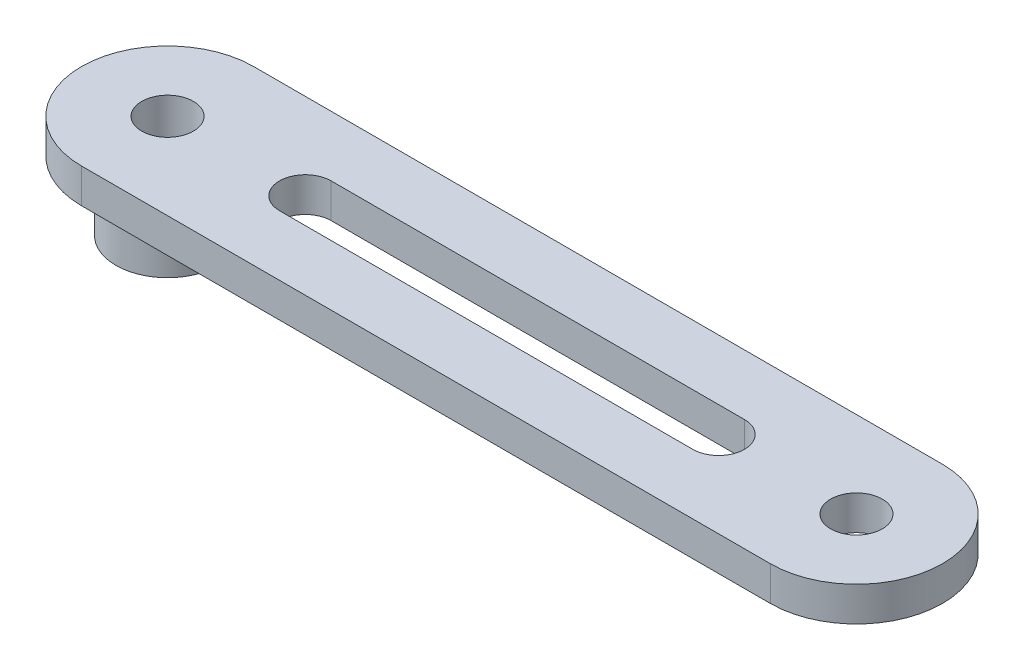
ISO-10303-21;
HEADER;
FILE_DESCRIPTION(('STEP AP214'),'2;1');
FILE_NAME('part.step','',(''),(''),'','','');
FILE_SCHEMA(('AUTOMOTIVE_DESIGN { 1 0 10303 214 1 1 1 1 }'));
ENDSEC;
DATA;
#1=APPLICATION_CONTEXT('core data for automotive mechanical design processes');
#2=APPLICATION_PROTOCOL_DEFINITION('international standard','automotive_design',2000,#1);
#3=PRODUCT_CONTEXT('',#1,'mechanical');
#4=PRODUCT('Part','Part','',(#3));
#5=PRODUCT_RELATED_PRODUCT_CATEGORY('part','',(#4));
#6=PRODUCT_DEFINITION_FORMATION('','',#4);
#7=PRODUCT_DEFINITION_CONTEXT('part definition',#1,'design');
#8=PRODUCT_DEFINITION('design','',#6,#7);
#9=PRODUCT_DEFINITION_SHAPE('','',#8);
#10=(LENGTH_UNIT() NAMED_UNIT(*) SI_UNIT(.MILLI.,.METRE.));
#11=(NAMED_UNIT(*) PLANE_ANGLE_UNIT() SI_UNIT($,.RADIAN.));
#12=(NAMED_UNIT(*) SI_UNIT($,.STERADIAN.) SOLID_ANGLE_UNIT());
#13=UNCERTAINTY_MEASURE_WITH_UNIT(LENGTH_MEASURE(1.E-05),#10,'distance_accuracy_value','');
#14=(GEOMETRIC_REPRESENTATION_CONTEXT(3) GLOBAL_UNCERTAINTY_ASSIGNED_CONTEXT((#13)) GLOBAL_UNIT_ASSIGNED_CONTEXT((#10,
#11,#12)) REPRESENTATION_CONTEXT('',''));
#15=CARTESIAN_POINT('',(0.,0.,0.));
#16=DIRECTION('',(0.,0.,1.));
#17=DIRECTION('',(1.,0.,0.));
#18=AXIS2_PLACEMENT_3D('',#15,#16,#17);
#19=CARTESIAN_POINT('',(-100.,0.,0.));
#20=DIRECTION('',(0.,1.,0.));
#21=DIRECTION('',(0.,0.,1.));
#22=AXIS2_PLACEMENT_3D('',#19,#20,#21);
#23=PLANE('',#22);
#24=CARTESIAN_POINT('',(100.,0.,0.));
#25=DIRECTION('',(0.,1.,0.));
#26=DIRECTION('',(0.,0.,1.));
#27=AXIS2_PLACEMENT_3D('',#24,#25,#26);
#28=CIRCLE('',#27,7.50000000000001);
#29=CARTESIAN_POINT('',(100.,0.,7.50000000000001));
#30=VERTEX_POINT('',#29);
#31=EDGE_CURVE('E386',#30,#30,#28,.T.);
#32=ORIENTED_EDGE('',*,*,#31,.T.);
#33=EDGE_LOOP('',(#32));
#34=FACE_BOUND('',#33,.T.);
#35=CARTESIAN_POINT('',(-60.,0.,0.));
#36=DIRECTION('',(0.,1.,0.));
#37=DIRECTION('',(0.,0.,1.));
#38=AXIS2_PLACEMENT_3D('',#35,#36,#37);
#39=CIRCLE('',#38,7.5);
#40=CARTESIAN_POINT('',(-60.,0.,-7.5));
#41=VERTEX_POINT('',#40);
#42=CARTESIAN_POINT('',(-60.,0.,7.5));
#43=VERTEX_POINT('',#42);
#44=EDGE_CURVE('E67',#41,#43,#39,.T.);
#45=ORIENTED_EDGE('',*,*,#44,.T.);
#46=DIRECTION('',(1.,0.,0.));
#47=VECTOR('',#46,1.);
#48=CARTESIAN_POINT('',(-60.,0.,7.5));
#49=LINE('',#48,#47);
#50=CARTESIAN_POINT('',(60.,0.,7.50000000000001));
#51=VERTEX_POINT('',#50);
#52=EDGE_CURVE('E125',#43,#51,#49,.T.);
#53=ORIENTED_EDGE('',*,*,#52,.T.);
#54=CARTESIAN_POINT('',(60.,0.,0.));
#55=DIRECTION('',(0.,1.,0.));
#56=DIRECTION('',(0.,0.,1.));
#57=AXIS2_PLACEMENT_3D('',#54,#55,#56);
#58=CIRCLE('',#57,7.50000000000001);
#59=CARTESIAN_POINT('',(60.,0.,-7.50000000000002));
#60=VERTEX_POINT('',#59);
#61=EDGE_CURVE('E148',#51,#60,#58,.T.);
#62=ORIENTED_EDGE('',*,*,#61,.T.);
#63=DIRECTION('',(-1.,0.,0.));
#64=VECTOR('',#63,1.);
#65=CARTESIAN_POINT('',(-60.,0.,-7.5));
#66=LINE('',#65,#64);
#67=EDGE_CURVE('E119',#60,#41,#66,.T.);
#68=ORIENTED_EDGE('',*,*,#67,.T.);
#69=EDGE_LOOP('',(#45,#53,#62,#68));
#70=FACE_BOUND('',#69,.T.);
#71=CARTESIAN_POINT('',(-100.,0.,0.));
#72=DIRECTION('',(0.,1.,0.));
#73=DIRECTION('',(0.,0.,1.));
#74=AXIS2_PLACEMENT_3D('',#71,#72,#73);
#75=CIRCLE('',#74,25.);
#76=CARTESIAN_POINT('',(-100.,0.,-25.));
#77=VERTEX_POINT('',#76);
#78=CARTESIAN_POINT('',(-100.,0.,25.));
#79=VERTEX_POINT('',#78);
#80=EDGE_CURVE('E127',#77,#79,#75,.T.);
#81=ORIENTED_EDGE('',*,*,#80,.F.);
#82=DIRECTION('',(-1.,0.,0.));
#83=VECTOR('',#82,1.);
#84=CARTESIAN_POINT('',(-100.,0.,-25.));
#85=LINE('',#84,#83);
#86=CARTESIAN_POINT('',(100.,0.,-25.0000000000001));
#87=VERTEX_POINT('',#86);
#88=EDGE_CURVE('E166',#87,#77,#85,.T.);
#89=ORIENTED_EDGE('',*,*,#88,.F.);
#90=CARTESIAN_POINT('',(100.,0.,0.));
#91=DIRECTION('',(0.,1.,0.));
#92=DIRECTION('',(0.,0.,1.));
#93=AXIS2_PLACEMENT_3D('',#90,#91,#92);
#94=CIRCLE('',#93,25.);
#95=CARTESIAN_POINT('',(100.,0.,25.));
#96=VERTEX_POINT('',#95);
#97=EDGE_CURVE('E182',#96,#87,#94,.T.);
#98=ORIENTED_EDGE('',*,*,#97,.F.);
#99=DIRECTION('',(1.,0.,0.));
#100=VECTOR('',#99,1.);
#101=CARTESIAN_POINT('',(-100.,0.,25.));
#102=LINE('',#101,#100);
#103=EDGE_CURVE('E179',#79,#96,#102,.T.);
#104=ORIENTED_EDGE('',*,*,#103,.F.);
#105=EDGE_LOOP('',(#81,#89,#98,#104));
#106=FACE_BOUND('',#105,.T.);
#107=CARTESIAN_POINT('',(-100.,0.,0.));
#108=DIRECTION('',(0.,1.,0.));
#109=DIRECTION('',(0.,0.,1.));
#110=AXIS2_PLACEMENT_3D('',#107,#108,#109);
#111=CIRCLE('',#110,15.);
#112=CARTESIAN_POINT('',(-100.,0.,15.));
#113=VERTEX_POINT('',#112);
#114=EDGE_CURVE('E11',#113,#113,#111,.F.);
#115=ORIENTED_EDGE('',*,*,#114,.F.);
#116=EDGE_LOOP('',(#115));
#117=FACE_BOUND('',#116,.T.);
#118=ADVANCED_FACE('F43',(#34,#70,#106,#117),#23,.F.);
#119=CARTESIAN_POINT('',(-100.,10.,0.));
#120=DIRECTION('',(0.,1.,0.));
#121=DIRECTION('',(0.,0.,1.));
#122=AXIS2_PLACEMENT_3D('',#119,#120,#121);
#123=PLANE('',#122);
#124=CARTESIAN_POINT('',(100.,10.,0.));
#125=DIRECTION('',(0.,1.,0.));
#126=DIRECTION('',(0.,0.,1.));
#127=AXIS2_PLACEMENT_3D('',#124,#125,#126);
#128=CIRCLE('',#127,7.50000000000001);
#129=CARTESIAN_POINT('',(100.,10.,7.50000000000001));
#130=VERTEX_POINT('',#129);
#131=EDGE_CURVE('E145',#130,#130,#128,.T.);
#132=ORIENTED_EDGE('',*,*,#131,.F.);
#133=EDGE_LOOP('',(#132));
#134=FACE_BOUND('',#133,.T.);
#135=CARTESIAN_POINT('',(-100.,10.,0.));
#136=DIRECTION('',(0.,1.,0.));
#137=DIRECTION('',(0.,0.,1.));
#138=AXIS2_PLACEMENT_3D('',#135,#136,#137);
#139=CIRCLE('',#138,25.);
#140=CARTESIAN_POINT('',(-100.,10.,-25.));
#141=VERTEX_POINT('',#140);
#142=CARTESIAN_POINT('',(-100.,10.,25.));
#143=VERTEX_POINT('',#142);
#144=EDGE_CURVE('E161',#141,#143,#139,.T.);
#145=ORIENTED_EDGE('',*,*,#144,.T.);
#146=DIRECTION('',(1.,0.,0.));
#147=VECTOR('',#146,1.);
#148=CARTESIAN_POINT('',(-100.,10.,25.));
#149=LINE('',#148,#147);
#150=CARTESIAN_POINT('',(100.,10.,25.));
#151=VERTEX_POINT('',#150);
#152=EDGE_CURVE('E165',#143,#151,#149,.T.);
#153=ORIENTED_EDGE('',*,*,#152,.T.);
#154=CARTESIAN_POINT('',(100.,10.,0.));
#155=DIRECTION('',(0.,1.,0.));
#156=DIRECTION('',(0.,0.,1.));
#157=AXIS2_PLACEMENT_3D('',#154,#155,#156);
#158=CIRCLE('',#157,25.);
#159=CARTESIAN_POINT('',(100.,10.,-25.0000000000001));
#160=VERTEX_POINT('',#159);
#161=EDGE_CURVE('E169',#151,#160,#158,.T.);
#162=ORIENTED_EDGE('',*,*,#161,.T.);
#163=DIRECTION('',(-1.,0.,0.));
#164=VECTOR('',#163,1.);
#165=CARTESIAN_POINT('',(-100.,10.,-25.));
#166=LINE('',#165,#164);
#167=EDGE_CURVE('E172',#160,#141,#166,.T.);
#168=ORIENTED_EDGE('',*,*,#167,.T.);
#169=EDGE_LOOP('',(#145,#153,#162,#168));
#170=FACE_BOUND('',#169,.T.);
#171=DIRECTION('',(1.,0.,0.));
#172=VECTOR('',#171,1.);
#173=CARTESIAN_POINT('',(-60.,10.,7.5));
#174=LINE('',#173,#172);
#175=CARTESIAN_POINT('',(-60.,10.,7.5));
#176=VERTEX_POINT('',#175);
#177=CARTESIAN_POINT('',(60.,10.,7.50000000000001));
#178=VERTEX_POINT('',#177);
#179=EDGE_CURVE('E118',#176,#178,#174,.T.);
#180=ORIENTED_EDGE('',*,*,#179,.F.);
#181=CARTESIAN_POINT('',(-60.,10.,0.));
#182=DIRECTION('',(0.,1.,0.));
#183=DIRECTION('',(0.,0.,1.));
#184=AXIS2_PLACEMENT_3D('',#181,#182,#183);
#185=CIRCLE('',#184,7.5);
#186=CARTESIAN_POINT('',(-60.,10.,-7.5));
#187=VERTEX_POINT('',#186);
#188=EDGE_CURVE('E109',#187,#176,#185,.T.);
#189=ORIENTED_EDGE('',*,*,#188,.F.);
#190=DIRECTION('',(-1.,0.,0.));
#191=VECTOR('',#190,1.);
#192=CARTESIAN_POINT('',(-60.,10.,-7.5));
#193=LINE('',#192,#191);
#194=CARTESIAN_POINT('',(60.,10.,-7.50000000000002));
#195=VERTEX_POINT('',#194);
#196=EDGE_CURVE('E137',#195,#187,#193,.T.);
#197=ORIENTED_EDGE('',*,*,#196,.F.);
#198=CARTESIAN_POINT('',(60.,10.,0.));
#199=DIRECTION('',(0.,1.,0.));
#200=DIRECTION('',(0.,0.,1.));
#201=AXIS2_PLACEMENT_3D('',#198,#199,#200);
#202=CIRCLE('',#201,7.50000000000001);
#203=EDGE_CURVE('E133',#178,#195,#202,.T.);
#204=ORIENTED_EDGE('',*,*,#203,.F.);
#205=EDGE_LOOP('',(#180,#189,#197,#204));
#206=FACE_BOUND('',#205,.T.);
#207=CARTESIAN_POINT('',(-100.,10.,0.));
#208=DIRECTION('',(0.,1.,0.));
#209=DIRECTION('',(0.,0.,1.));
#210=AXIS2_PLACEMENT_3D('',#207,#208,#209);
#211=CIRCLE('',#210,7.50000000000001);
#212=CARTESIAN_POINT('',(-100.,10.,7.50000000000001));
#213=VERTEX_POINT('',#212);
#214=EDGE_CURVE('E380',#213,#213,#211,.T.);
#215=ORIENTED_EDGE('',*,*,#214,.F.);
#216=EDGE_LOOP('',(#215));
#217=FACE_BOUND('',#216,.T.);
#218=ADVANCED_FACE('F131',(#134,#170,#206,#217),#123,.T.);
#219=CARTESIAN_POINT('',(-100.,10.,0.));
#220=DIRECTION('',(0.,-1.,0.));
#221=DIRECTION('',(0.,0.,-1.));
#222=AXIS2_PLACEMENT_3D('',#219,#220,#221);
#223=CYLINDRICAL_SURFACE('',#222,25.);
#224=ORIENTED_EDGE('',*,*,#80,.T.);
#225=DIRECTION('',(0.,-1.,0.));
#226=VECTOR('',#225,1.);
#227=CARTESIAN_POINT('',(-100.,10.,25.));
#228=LINE('',#227,#226);
#229=EDGE_CURVE('E52',#143,#79,#228,.T.);
#230=ORIENTED_EDGE('',*,*,#229,.F.);
#231=ORIENTED_EDGE('',*,*,#144,.F.);
#232=DIRECTION('',(0.,-1.,0.));
#233=VECTOR('',#232,1.);
#234=CARTESIAN_POINT('',(-100.,10.,-25.));
#235=LINE('',#234,#233);
#236=EDGE_CURVE('E175',#141,#77,#235,.T.);
#237=ORIENTED_EDGE('',*,*,#236,.T.);
#238=EDGE_LOOP('',(#224,#230,#231,#237));
#239=FACE_BOUND('',#238,.T.);
#240=ADVANCED_FACE('F45',(#239),#223,.T.);
#241=CARTESIAN_POINT('',(-100.,10.,25.));
#242=DIRECTION('',(0.,0.,-1.));
#243=DIRECTION('',(-1.,0.,0.));
#244=AXIS2_PLACEMENT_3D('',#241,#242,#243);
#245=PLANE('',#244);
#246=ORIENTED_EDGE('',*,*,#103,.T.);
#247=DIRECTION('',(0.,-1.,0.));
#248=VECTOR('',#247,1.);
#249=CARTESIAN_POINT('',(100.,10.,25.));
#250=LINE('',#249,#248);
#251=EDGE_CURVE('E194',#151,#96,#250,.T.);
#252=ORIENTED_EDGE('',*,*,#251,.F.);
#253=ORIENTED_EDGE('',*,*,#152,.F.);
#254=ORIENTED_EDGE('',*,*,#229,.T.);
#255=EDGE_LOOP('',(#246,#252,#253,#254));
#256=FACE_BOUND('',#255,.T.);
#257=ADVANCED_FACE('F201',(#256),#245,.F.);
#258=CARTESIAN_POINT('',(100.,10.,0.));
#259=DIRECTION('',(0.,-1.,0.));
#260=DIRECTION('',(0.,0.,-1.));
#261=AXIS2_PLACEMENT_3D('',#258,#259,#260);
#262=CYLINDRICAL_SURFACE('',#261,25.);
#263=ORIENTED_EDGE('',*,*,#97,.T.);
#264=DIRECTION('',(0.,-1.,0.));
#265=VECTOR('',#264,1.);
#266=CARTESIAN_POINT('',(100.,10.,-25.0000000000001));
#267=LINE('',#266,#265);
#268=EDGE_CURVE('E190',#160,#87,#267,.T.);
#269=ORIENTED_EDGE('',*,*,#268,.F.);
#270=ORIENTED_EDGE('',*,*,#161,.F.);
#271=ORIENTED_EDGE('',*,*,#251,.T.);
#272=EDGE_LOOP('',(#263,#269,#270,#271));
#273=FACE_BOUND('',#272,.T.);
#274=ADVANCED_FACE('F213',(#273),#262,.T.);
#275=CARTESIAN_POINT('',(-100.,10.,-25.));
#276=DIRECTION('',(0.,0.,1.));
#277=DIRECTION('',(1.,0.,0.));
#278=AXIS2_PLACEMENT_3D('',#275,#276,#277);
#279=PLANE('',#278);
#280=ORIENTED_EDGE('',*,*,#88,.T.);
#281=ORIENTED_EDGE('',*,*,#236,.F.);
#282=ORIENTED_EDGE('',*,*,#167,.F.);
#283=ORIENTED_EDGE('',*,*,#268,.T.);
#284=EDGE_LOOP('',(#280,#281,#282,#283));
#285=FACE_BOUND('',#284,.T.);
#286=ADVANCED_FACE('F217',(#285),#279,.F.);
#287=CARTESIAN_POINT('',(-60.,10.,0.));
#288=DIRECTION('',(0.,-1.,0.));
#289=DIRECTION('',(0.,0.,-1.));
#290=AXIS2_PLACEMENT_3D('',#287,#288,#289);
#291=CYLINDRICAL_SURFACE('',#290,7.5);
#292=ORIENTED_EDGE('',*,*,#44,.F.);
#293=DIRECTION('',(0.,-1.,0.));
#294=VECTOR('',#293,1.);
#295=CARTESIAN_POINT('',(-60.,10.,-7.5));
#296=LINE('',#295,#294);
#297=EDGE_CURVE('E113',#187,#41,#296,.T.);
#298=ORIENTED_EDGE('',*,*,#297,.F.);
#299=ORIENTED_EDGE('',*,*,#188,.T.);
#300=DIRECTION('',(0.,-1.,0.));
#301=VECTOR('',#300,1.);
#302=CARTESIAN_POINT('',(-60.,10.,7.5));
#303=LINE('',#302,#301);
#304=EDGE_CURVE('E112',#176,#43,#303,.T.);
#305=ORIENTED_EDGE('',*,*,#304,.T.);
#306=EDGE_LOOP('',(#292,#298,#299,#305));
#307=FACE_BOUND('',#306,.T.);
#308=ADVANCED_FACE('F111',(#307),#291,.F.);
#309=CARTESIAN_POINT('',(-60.,10.,7.5));
#310=DIRECTION('',(0.,0.,-1.));
#311=DIRECTION('',(-1.,0.,0.));
#312=AXIS2_PLACEMENT_3D('',#309,#310,#311);
#313=PLANE('',#312);
#314=ORIENTED_EDGE('',*,*,#52,.F.);
#315=ORIENTED_EDGE('',*,*,#304,.F.);
#316=ORIENTED_EDGE('',*,*,#179,.T.);
#317=DIRECTION('',(0.,-1.,0.));
#318=VECTOR('',#317,1.);
#319=CARTESIAN_POINT('',(60.,10.,7.50000000000001));
#320=LINE('',#319,#318);
#321=EDGE_CURVE('E128',#178,#51,#320,.T.);
#322=ORIENTED_EDGE('',*,*,#321,.T.);
#323=EDGE_LOOP('',(#314,#315,#316,#322));
#324=FACE_BOUND('',#323,.T.);
#325=ADVANCED_FACE('F122',(#324),#313,.T.);
#326=CARTESIAN_POINT('',(60.,10.,0.));
#327=DIRECTION('',(0.,-1.,0.));
#328=DIRECTION('',(0.,0.,-1.));
#329=AXIS2_PLACEMENT_3D('',#326,#327,#328);
#330=CYLINDRICAL_SURFACE('',#329,7.50000000000001);
#331=ORIENTED_EDGE('',*,*,#61,.F.);
#332=ORIENTED_EDGE('',*,*,#321,.F.);
#333=ORIENTED_EDGE('',*,*,#203,.T.);
#334=DIRECTION('',(0.,-1.,0.));
#335=VECTOR('',#334,1.);
#336=CARTESIAN_POINT('',(60.,10.,-7.50000000000002));
#337=LINE('',#336,#335);
#338=EDGE_CURVE('E59',#195,#60,#337,.T.);
#339=ORIENTED_EDGE('',*,*,#338,.T.);
#340=EDGE_LOOP('',(#331,#332,#333,#339));
#341=FACE_BOUND('',#340,.T.);
#342=ADVANCED_FACE('F259',(#341),#330,.F.);
#343=CARTESIAN_POINT('',(-60.,10.,-7.5));
#344=DIRECTION('',(0.,0.,1.));
#345=DIRECTION('',(1.,0.,0.));
#346=AXIS2_PLACEMENT_3D('',#343,#344,#345);
#347=PLANE('',#346);
#348=ORIENTED_EDGE('',*,*,#67,.F.);
#349=ORIENTED_EDGE('',*,*,#338,.F.);
#350=ORIENTED_EDGE('',*,*,#196,.T.);
#351=ORIENTED_EDGE('',*,*,#297,.T.);
#352=EDGE_LOOP('',(#348,#349,#350,#351));
#353=FACE_BOUND('',#352,.T.);
#354=ADVANCED_FACE('F265',(#353),#347,.T.);
#355=CARTESIAN_POINT('',(100.,10.,0.));
#356=DIRECTION('',(0.,-1.,0.));
#357=DIRECTION('',(0.,0.,-1.));
#358=AXIS2_PLACEMENT_3D('',#355,#356,#357);
#359=CYLINDRICAL_SURFACE('',#358,7.50000000000001);
#360=ORIENTED_EDGE('',*,*,#131,.T.);
#361=EDGE_LOOP('',(#360));
#362=FACE_BOUND('',#361,.T.);
#363=ORIENTED_EDGE('',*,*,#31,.F.);
#364=EDGE_LOOP('',(#363));
#365=FACE_BOUND('',#364,.T.);
#366=ADVANCED_FACE('F273',(#362,#365),#359,.F.);
#367=CARTESIAN_POINT('',(-100.,10.,0.));
#368=DIRECTION('',(0.,-1.,0.));
#369=DIRECTION('',(0.,0.,-1.));
#370=AXIS2_PLACEMENT_3D('',#367,#368,#369);
#371=CYLINDRICAL_SURFACE('',#370,7.50000000000001);
#372=ORIENTED_EDGE('',*,*,#214,.T.);
#373=EDGE_LOOP('',(#372));
#374=FACE_BOUND('',#373,.T.);
#375=CARTESIAN_POINT('',(-100.,-20.,0.));
#376=DIRECTION('',(0.,-1.,0.));
#377=DIRECTION('',(0.,0.,-1.));
#378=AXIS2_PLACEMENT_3D('',#375,#376,#377);
#379=CIRCLE('',#378,7.50000000000001);
#380=CARTESIAN_POINT('',(-100.,-20.,-7.50000000000001));
#381=VERTEX_POINT('',#380);
#382=EDGE_CURVE('E381',#381,#381,#379,.T.);
#383=ORIENTED_EDGE('',*,*,#382,.T.);
#384=EDGE_LOOP('',(#383));
#385=FACE_BOUND('',#384,.T.);
#386=ADVANCED_FACE('F280',(#374,#385),#371,.F.);
#387=CARTESIAN_POINT('',(-100.,-20.,0.));
#388=DIRECTION('',(0.,-1.,0.));
#389=DIRECTION('',(0.,0.,-1.));
#390=AXIS2_PLACEMENT_3D('',#387,#388,#389);
#391=PLANE('',#390);
#392=CARTESIAN_POINT('',(-100.,-20.,0.));
#393=DIRECTION('',(0.,-1.,0.));
#394=DIRECTION('',(0.,0.,-1.));
#395=AXIS2_PLACEMENT_3D('',#392,#393,#394);
#396=CIRCLE('',#395,15.);
#397=CARTESIAN_POINT('',(-100.,-20.,-15.));
#398=VERTEX_POINT('',#397);
#399=EDGE_CURVE('E377',#398,#398,#396,.T.);
#400=ORIENTED_EDGE('',*,*,#399,.T.);
#401=EDGE_LOOP('',(#400));
#402=FACE_BOUND('',#401,.T.);
#403=ORIENTED_EDGE('',*,*,#382,.F.);
#404=EDGE_LOOP('',(#403));
#405=FACE_BOUND('',#404,.T.);
#406=ADVANCED_FACE('F289',(#402,#405),#391,.T.);
#407=CARTESIAN_POINT('',(-100.,-20.,0.));
#408=DIRECTION('',(0.,1.,0.));
#409=DIRECTION('',(0.,0.,1.));
#410=AXIS2_PLACEMENT_3D('',#407,#408,#409);
#411=CYLINDRICAL_SURFACE('',#410,15.);
#412=ORIENTED_EDGE('',*,*,#399,.F.);
#413=EDGE_LOOP('',(#412));
#414=FACE_BOUND('',#413,.T.);
#415=ORIENTED_EDGE('',*,*,#114,.T.);
#416=EDGE_LOOP('',(#415));
#417=FACE_BOUND('',#416,.T.);
#418=ADVANCED_FACE('F297',(#414,#417),#411,.T.);
#419=CLOSED_SHELL('',(#118,#218,#240,#257,#274,#286,#308,#325,#342,#354,#366,#386,#406,#418));
#420=MANIFOLD_SOLID_BREP('B2',#419);
#421=ADVANCED_BREP_SHAPE_REPRESENTATION('',(#18,#420),#14);
#422=SHAPE_DEFINITION_REPRESENTATION(#9,#421);
ENDSEC;
END-ISO-10303-21;
